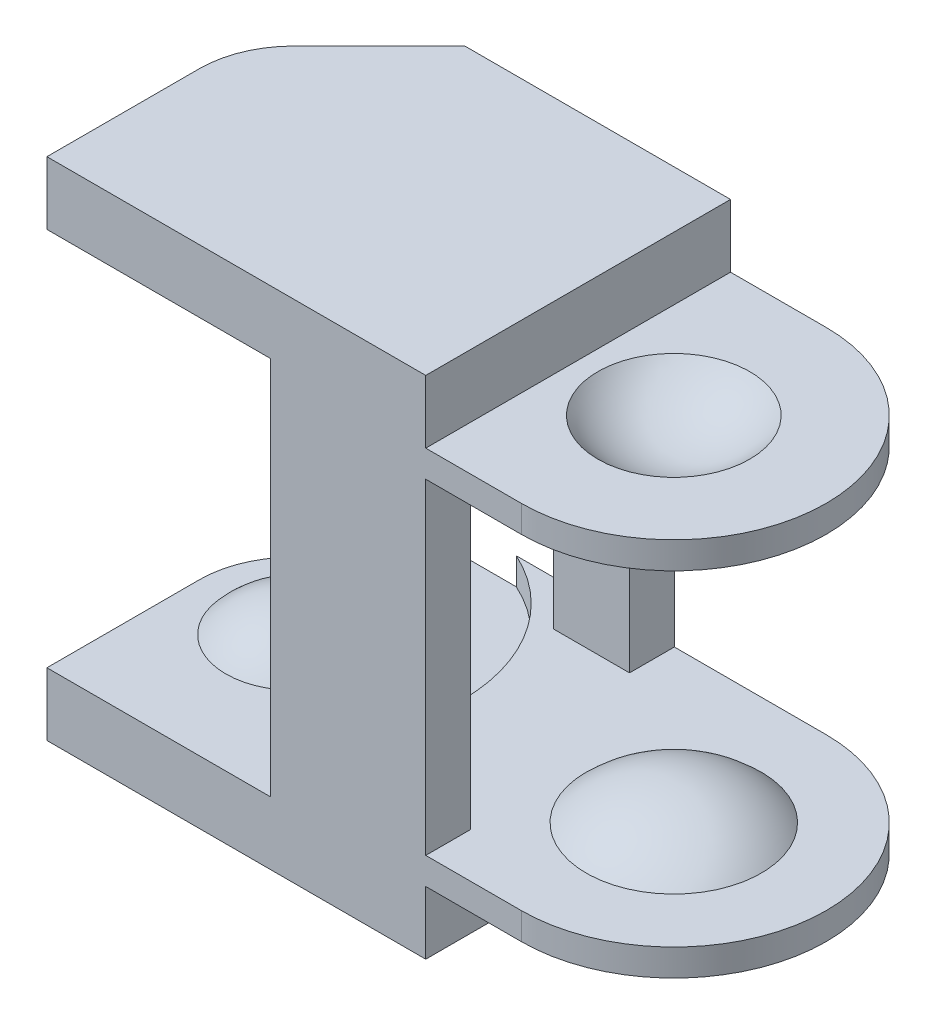
ISO-10303-21;
HEADER;
FILE_DESCRIPTION(('STEP AP214'),'2;1');
FILE_NAME('part.step','',(''),(''),'','','');
FILE_SCHEMA(('AUTOMOTIVE_DESIGN { 1 0 10303 214 1 1 1 1 }'));
ENDSEC;
DATA;
#1=APPLICATION_CONTEXT('core data for automotive mechanical design processes');
#2=APPLICATION_PROTOCOL_DEFINITION('international standard','automotive_design',2000,#1);
#3=PRODUCT_CONTEXT('',#1,'mechanical');
#4=PRODUCT('Part','Part','',(#3));
#5=PRODUCT_RELATED_PRODUCT_CATEGORY('part','',(#4));
#6=PRODUCT_DEFINITION_FORMATION('','',#4);
#7=PRODUCT_DEFINITION_CONTEXT('part definition',#1,'design');
#8=PRODUCT_DEFINITION('design','',#6,#7);
#9=PRODUCT_DEFINITION_SHAPE('','',#8);
#10=(LENGTH_UNIT() NAMED_UNIT(*) SI_UNIT(.MILLI.,.METRE.));
#11=(NAMED_UNIT(*) PLANE_ANGLE_UNIT() SI_UNIT($,.RADIAN.));
#12=(NAMED_UNIT(*) SI_UNIT($,.STERADIAN.) SOLID_ANGLE_UNIT());
#13=UNCERTAINTY_MEASURE_WITH_UNIT(LENGTH_MEASURE(1.E-05),#10,'distance_accuracy_value','');
#14=(GEOMETRIC_REPRESENTATION_CONTEXT(3) GLOBAL_UNCERTAINTY_ASSIGNED_CONTEXT((#13)) GLOBAL_UNIT_ASSIGNED_CONTEXT((#10,
#11,#12)) REPRESENTATION_CONTEXT('',''));
#15=CARTESIAN_POINT('',(0.,0.,0.));
#16=DIRECTION('',(0.,0.,1.));
#17=DIRECTION('',(1.,0.,0.));
#18=AXIS2_PLACEMENT_3D('',#15,#16,#17);
#19=CARTESIAN_POINT('',(0.961889819897504,-0.9,-21.4562459645916));
#20=DIRECTION('',(0.,-1.,0.));
#21=DIRECTION('',(0.,0.,-1.));
#22=AXIS2_PLACEMENT_3D('',#19,#20,#21);
#23=PLANE('',#22);
#24=CARTESIAN_POINT('',(6.35,-0.900000000000002,-3.175));
#25=DIRECTION('',(0.,1.,0.));
#26=DIRECTION('',(-1.,0.,0.));
#27=AXIS2_PLACEMENT_3D('',#24,#25,#26);
#28=CIRCLE('',#27,2.92856225556152);
#29=CARTESIAN_POINT('',(3.42143774443848,-0.900000000000004,-3.175));
#30=VERTEX_POINT('',#29);
#31=EDGE_CURVE('E296',#30,#30,#28,.T.);
#32=ORIENTED_EDGE('',*,*,#31,.T.);
#33=EDGE_LOOP('',(#32));
#34=FACE_BOUND('',#33,.T.);
#35=DIRECTION('',(-1.,0.,0.));
#36=VECTOR('',#35,1.);
#37=CARTESIAN_POINT('',(1.27,-0.9,-6.773779639795));
#38=LINE('',#37,#36);
#39=CARTESIAN_POINT('',(1.27,-0.9,-6.773779639795));
#40=VERTEX_POINT('',#39);
#41=CARTESIAN_POINT('',(-1.27,-0.9,-6.773779639795));
#42=VERTEX_POINT('',#41);
#43=EDGE_CURVE('E49',#40,#42,#38,.T.);
#44=ORIENTED_EDGE('',*,*,#43,.F.);
#45=DIRECTION('',(0.,0.,1.));
#46=VECTOR('',#45,1.);
#47=CARTESIAN_POINT('',(1.27,-0.9,-8.273779639795));
#48=LINE('',#47,#46);
#49=CARTESIAN_POINT('',(1.27,-0.9,-8.273779639795));
#50=VERTEX_POINT('',#49);
#51=EDGE_CURVE('E268',#50,#40,#48,.T.);
#52=ORIENTED_EDGE('',*,*,#51,.F.);
#53=DIRECTION('',(1.,0.,0.));
#54=VECTOR('',#53,1.);
#55=CARTESIAN_POINT('',(0.961889819897504,-0.9,-8.273779639795));
#56=LINE('',#55,#54);
#57=CARTESIAN_POINT('',(6.35,-0.9,-8.273779639795));
#58=VERTEX_POINT('',#57);
#59=EDGE_CURVE('E220',#50,#58,#56,.T.);
#60=ORIENTED_EDGE('',*,*,#59,.T.);
#61=CARTESIAN_POINT('',(6.35,-0.9,-3.175));
#62=DIRECTION('',(0.,-1.,0.));
#63=DIRECTION('',(0.,0.,-1.));
#64=AXIS2_PLACEMENT_3D('',#61,#62,#63);
#65=CIRCLE('',#64,5.09877963979501);
#66=CARTESIAN_POINT('',(6.35,-0.9,1.92377963979501));
#67=VERTEX_POINT('',#66);
#68=EDGE_CURVE('E306',#58,#67,#65,.T.);
#69=ORIENTED_EDGE('',*,*,#68,.T.);
#70=DIRECTION('',(-1.,0.,0.));
#71=VECTOR('',#70,1.);
#72=CARTESIAN_POINT('',(0.961889819897509,-0.9,1.92377963979501));
#73=LINE('',#72,#71);
#74=CARTESIAN_POINT('',(3.1496,-0.9,1.92377963979501));
#75=VERTEX_POINT('',#74);
#76=EDGE_CURVE('E308',#67,#75,#73,.T.);
#77=ORIENTED_EDGE('',*,*,#76,.T.);
#78=DIRECTION('',(0.,0.,-1.));
#79=VECTOR('',#78,1.);
#80=CARTESIAN_POINT('',(3.1496,-0.9,-21.4562459645916));
#81=LINE('',#80,#79);
#82=CARTESIAN_POINT('',(3.1496,-0.9,0.423779639795008));
#83=VERTEX_POINT('',#82);
#84=EDGE_CURVE('E290',#75,#83,#81,.T.);
#85=ORIENTED_EDGE('',*,*,#84,.T.);
#86=DIRECTION('',(-1.,0.,0.));
#87=VECTOR('',#86,1.);
#88=CARTESIAN_POINT('',(0.961889819897504,-0.9,0.423779639795008));
#89=LINE('',#88,#87);
#90=CARTESIAN_POINT('',(-2.05060899272738,-0.9,0.423779639795008));
#91=VERTEX_POINT('',#90);
#92=EDGE_CURVE('E287',#83,#91,#89,.T.);
#93=ORIENTED_EDGE('',*,*,#92,.T.);
#94=CARTESIAN_POINT('',(-6.35,-0.9,-3.175));
#95=DIRECTION('',(0.,-1.,0.));
#96=DIRECTION('',(0.,0.,-1.));
#97=AXIS2_PLACEMENT_3D('',#94,#95,#96);
#98=CIRCLE('',#97,5.606779639795);
#99=CARTESIAN_POINT('',(-4.01795709429871,-0.9,-8.273779639795));
#100=VERTEX_POINT('',#99);
#101=EDGE_CURVE('E300',#100,#91,#98,.T.);
#102=ORIENTED_EDGE('',*,*,#101,.F.);
#103=CARTESIAN_POINT('',(-1.27,-0.9,-8.273779639795));
#104=VERTEX_POINT('',#103);
#105=EDGE_CURVE('E304',#100,#104,#56,.T.);
#106=ORIENTED_EDGE('',*,*,#105,.T.);
#107=DIRECTION('',(0.,0.,-1.));
#108=VECTOR('',#107,1.);
#109=CARTESIAN_POINT('',(-1.27,-0.9,-8.273779639795));
#110=LINE('',#109,#108);
#111=EDGE_CURVE('E54',#42,#104,#110,.T.);
#112=ORIENTED_EDGE('',*,*,#111,.F.);
#113=EDGE_LOOP('',(#44,#52,#60,#69,#77,#85,#93,#102,#106,#112));
#114=FACE_BOUND('',#113,.T.);
#115=ADVANCED_FACE('F34',(#34,#114),#23,.T.);
#116=CARTESIAN_POINT('',(0.961889819897504,0.,-21.4562459645916));
#117=DIRECTION('',(0.,-1.,0.));
#118=DIRECTION('',(0.,0.,-1.));
#119=AXIS2_PLACEMENT_3D('',#116,#117,#118);
#120=PLANE('',#119);
#121=DIRECTION('',(0.,0.,-1.));
#122=VECTOR('',#121,1.);
#123=CARTESIAN_POINT('',(3.1496,0.,-3.175));
#124=LINE('',#123,#122);
#125=CARTESIAN_POINT('',(3.1496,0.,1.92377963979501));
#126=VERTEX_POINT('',#125);
#127=CARTESIAN_POINT('',(3.1496,0.,-8.273779639795));
#128=VERTEX_POINT('',#127);
#129=EDGE_CURVE('E335',#126,#128,#124,.T.);
#130=ORIENTED_EDGE('',*,*,#129,.F.);
#131=DIRECTION('',(-1.,0.,0.));
#132=VECTOR('',#131,1.);
#133=CARTESIAN_POINT('',(0.961889819897509,0.,1.92377963979501));
#134=LINE('',#133,#132);
#135=CARTESIAN_POINT('',(6.35,0.,1.92377963979501));
#136=VERTEX_POINT('',#135);
#137=EDGE_CURVE('E360',#136,#126,#134,.T.);
#138=ORIENTED_EDGE('',*,*,#137,.F.);
#139=CARTESIAN_POINT('',(6.35,0.,-3.175));
#140=DIRECTION('',(0.,-1.,0.));
#141=DIRECTION('',(0.,0.,-1.));
#142=AXIS2_PLACEMENT_3D('',#139,#140,#141);
#143=CIRCLE('',#142,5.09877963979501);
#144=CARTESIAN_POINT('',(6.35,0.,-8.273779639795));
#145=VERTEX_POINT('',#144);
#146=EDGE_CURVE('E381',#145,#136,#143,.T.);
#147=ORIENTED_EDGE('',*,*,#146,.F.);
#148=DIRECTION('',(1.,0.,0.));
#149=VECTOR('',#148,1.);
#150=CARTESIAN_POINT('',(0.961889819897504,0.,-8.273779639795));
#151=LINE('',#150,#149);
#152=EDGE_CURVE('E317',#128,#145,#151,.T.);
#153=ORIENTED_EDGE('',*,*,#152,.F.);
#154=EDGE_LOOP('',(#130,#138,#147,#153));
#155=FACE_BOUND('',#154,.T.);
#156=CARTESIAN_POINT('',(6.35,0.,-3.175));
#157=DIRECTION('',(0.,1.,0.));
#158=DIRECTION('',(0.,0.,1.));
#159=AXIS2_PLACEMENT_3D('',#156,#157,#158);
#160=CIRCLE('',#159,2.54);
#161=CARTESIAN_POINT('',(6.35,0.,-0.634999999999999));
#162=VERTEX_POINT('',#161);
#163=EDGE_CURVE('E293',#162,#162,#160,.T.);
#164=ORIENTED_EDGE('',*,*,#163,.F.);
#165=EDGE_LOOP('',(#164));
#166=FACE_BOUND('',#165,.T.);
#167=ADVANCED_FACE('F472',(#155,#166),#120,.F.);
#168=CARTESIAN_POINT('',(-6.35,0.,-3.175));
#169=DIRECTION('',(0.,1.,0.));
#170=DIRECTION('',(0.,0.,1.));
#171=AXIS2_PLACEMENT_3D('',#168,#169,#170);
#172=PLANE('',#171);
#173=DIRECTION('',(-1.,0.,0.));
#174=VECTOR('',#173,1.);
#175=CARTESIAN_POINT('',(-5.74134842073958,0.,-8.273779639795));
#176=LINE('',#175,#174);
#177=CARTESIAN_POINT('',(-4.01795709429871,0.,-8.273779639795));
#178=VERTEX_POINT('',#177);
#179=CARTESIAN_POINT('',(-5.74134842073958,0.,-8.273779639795));
#180=VERTEX_POINT('',#179);
#181=EDGE_CURVE('E338',#178,#180,#176,.T.);
#182=ORIENTED_EDGE('',*,*,#181,.F.);
#183=CARTESIAN_POINT('',(-6.35,0.,-3.175));
#184=DIRECTION('',(0.,-1.,0.));
#185=DIRECTION('',(0.,0.,-1.));
#186=AXIS2_PLACEMENT_3D('',#183,#184,#185);
#187=CIRCLE('',#186,5.606779639795);
#188=CARTESIAN_POINT('',(-2.05060899272738,0.,0.423779639795008));
#189=VERTEX_POINT('',#188);
#190=EDGE_CURVE('E299',#178,#189,#187,.T.);
#191=ORIENTED_EDGE('',*,*,#190,.T.);
#192=DIRECTION('',(0.,0.,-1.));
#193=VECTOR('',#192,1.);
#194=CARTESIAN_POINT('',(-2.05060899272738,0.,-21.4562459645916));
#195=LINE('',#194,#193);
#196=CARTESIAN_POINT('',(-2.05060899272738,0.,1.92377963979501));
#197=VERTEX_POINT('',#196);
#198=EDGE_CURVE('E303',#197,#189,#195,.T.);
#199=ORIENTED_EDGE('',*,*,#198,.F.);
#200=DIRECTION('',(1.,0.,0.));
#201=VECTOR('',#200,1.);
#202=CARTESIAN_POINT('',(-6.98990972304999,0.,1.92377963979501));
#203=LINE('',#202,#201);
#204=CARTESIAN_POINT('',(-9.525,0.,1.92377963979501));
#205=VERTEX_POINT('',#204);
#206=EDGE_CURVE('E339',#205,#197,#203,.T.);
#207=ORIENTED_EDGE('',*,*,#206,.F.);
#208=DIRECTION('',(0.,0.,1.));
#209=VECTOR('',#208,1.);
#210=CARTESIAN_POINT('',(-9.525,0.,-3.17499999999998));
#211=LINE('',#210,#209);
#212=CARTESIAN_POINT('',(-9.525,0.,-3.17499999999998));
#213=VERTEX_POINT('',#212);
#214=EDGE_CURVE('E357',#213,#205,#211,.T.);
#215=ORIENTED_EDGE('',*,*,#214,.F.);
#216=CARTESIAN_POINT('',(-6.35,0.,-3.175));
#217=DIRECTION('',(0.,1.,0.));
#218=DIRECTION('',(0.,0.,1.));
#219=AXIS2_PLACEMENT_3D('',#216,#217,#218);
#220=CIRCLE('',#219,3.175);
#221=CARTESIAN_POINT('',(-8.59506403026729,0.,-5.42006403026728));
#222=VERTEX_POINT('',#221);
#223=EDGE_CURVE('E323',#222,#213,#220,.T.);
#224=ORIENTED_EDGE('',*,*,#223,.F.);
#225=DIRECTION('',(-0.707106781186546,0.,0.707106781186549));
#226=VECTOR('',#225,1.);
#227=CARTESIAN_POINT('',(-8.59506403026729,0.,-5.42006403026728));
#228=LINE('',#227,#226);
#229=EDGE_CURVE('E349',#180,#222,#228,.T.);
#230=ORIENTED_EDGE('',*,*,#229,.F.);
#231=EDGE_LOOP('',(#182,#191,#199,#207,#215,#224,#230));
#232=FACE_BOUND('',#231,.T.);
#233=CARTESIAN_POINT('',(-6.35,0.,-3.175));
#234=DIRECTION('',(0.,1.,0.));
#235=DIRECTION('',(0.,0.,1.));
#236=AXIS2_PLACEMENT_3D('',#233,#234,#235);
#237=CIRCLE('',#236,2.286);
#238=CARTESIAN_POINT('',(-6.35,0.,-0.888999999999999));
#239=VERTEX_POINT('',#238);
#240=EDGE_CURVE('E11',#239,#239,#237,.F.);
#241=ORIENTED_EDGE('',*,*,#240,.F.);
#242=EDGE_LOOP('',(#241));
#243=FACE_BOUND('',#242,.T.);
#244=ADVANCED_FACE('F420',(#232,#243),#172,.F.);
#245=CARTESIAN_POINT('',(-6.35,2.1082,-3.175));
#246=DIRECTION('',(0.,-1.,0.));
#247=DIRECTION('',(0.,0.,-1.));
#248=AXIS2_PLACEMENT_3D('',#245,#246,#247);
#249=CYLINDRICAL_SURFACE('',#248,3.175);
#250=ORIENTED_EDGE('',*,*,#223,.T.);
#251=DIRECTION('',(0.,-1.,0.));
#252=VECTOR('',#251,1.);
#253=CARTESIAN_POINT('',(-9.525,2.1082,-3.17499999999998));
#254=LINE('',#253,#252);
#255=CARTESIAN_POINT('',(-9.525,2.1082,-3.17499999999998));
#256=VERTEX_POINT('',#255);
#257=EDGE_CURVE('E42',#256,#213,#254,.T.);
#258=ORIENTED_EDGE('',*,*,#257,.F.);
#259=CARTESIAN_POINT('',(-6.35,2.1082,-3.175));
#260=DIRECTION('',(0.,1.,0.));
#261=DIRECTION('',(0.,0.,1.));
#262=AXIS2_PLACEMENT_3D('',#259,#260,#261);
#263=CIRCLE('',#262,3.175);
#264=CARTESIAN_POINT('',(-8.59506403026729,2.1082,-5.42006403026728));
#265=VERTEX_POINT('',#264);
#266=EDGE_CURVE('E383',#265,#256,#263,.T.);
#267=ORIENTED_EDGE('',*,*,#266,.F.);
#268=DIRECTION('',(0.,-1.,0.));
#269=VECTOR('',#268,1.);
#270=CARTESIAN_POINT('',(-8.59506403026729,2.1082,-5.42006403026728));
#271=LINE('',#270,#269);
#272=EDGE_CURVE('E396',#265,#222,#271,.T.);
#273=ORIENTED_EDGE('',*,*,#272,.T.);
#274=EDGE_LOOP('',(#250,#258,#267,#273));
#275=FACE_BOUND('',#274,.T.);
#276=ADVANCED_FACE('F36',(#275),#249,.T.);
#277=CARTESIAN_POINT('',(-9.525,2.1082,-3.17499999999998));
#278=DIRECTION('',(1.,0.,0.));
#279=DIRECTION('',(0.,0.,-1.));
#280=AXIS2_PLACEMENT_3D('',#277,#278,#279);
#281=PLANE('',#280);
#282=ORIENTED_EDGE('',*,*,#214,.T.);
#283=DIRECTION('',(0.,-1.,0.));
#284=VECTOR('',#283,1.);
#285=CARTESIAN_POINT('',(-9.525,2.1082,1.92377963979501));
#286=LINE('',#285,#284);
#287=CARTESIAN_POINT('',(-9.525,2.1082,1.92377963979501));
#288=VERTEX_POINT('',#287);
#289=EDGE_CURVE('E334',#288,#205,#286,.T.);
#290=ORIENTED_EDGE('',*,*,#289,.F.);
#291=DIRECTION('',(0.,0.,1.));
#292=VECTOR('',#291,1.);
#293=CARTESIAN_POINT('',(-9.525,2.1082,-3.17499999999998));
#294=LINE('',#293,#292);
#295=EDGE_CURVE('E386',#256,#288,#294,.T.);
#296=ORIENTED_EDGE('',*,*,#295,.F.);
#297=ORIENTED_EDGE('',*,*,#257,.T.);
#298=EDGE_LOOP('',(#282,#290,#296,#297));
#299=FACE_BOUND('',#298,.T.);
#300=ADVANCED_FACE('F403',(#299),#281,.F.);
#301=CARTESIAN_POINT('',(-6.98990972304999,2.1082,1.92377963979501));
#302=DIRECTION('',(0.,0.,-1.));
#303=DIRECTION('',(-1.,0.,0.));
#304=AXIS2_PLACEMENT_3D('',#301,#302,#303);
#305=PLANE('',#304);
#306=ORIENTED_EDGE('',*,*,#206,.T.);
#307=DIRECTION('',(0.,1.,0.));
#308=VECTOR('',#307,1.);
#309=CARTESIAN_POINT('',(-2.05060899272738,-0.9,1.92377963979501));
#310=LINE('',#309,#308);
#311=CARTESIAN_POINT('',(-2.05060899272738,-12.7,1.92377963979501));
#312=VERTEX_POINT('',#311);
#313=EDGE_CURVE('E362',#312,#197,#310,.T.);
#314=ORIENTED_EDGE('',*,*,#313,.F.);
#315=DIRECTION('',(1.,0.,0.));
#316=VECTOR('',#315,1.);
#317=CARTESIAN_POINT('',(-6.98990972304999,-12.7,1.92377963979501));
#318=LINE('',#317,#316);
#319=CARTESIAN_POINT('',(-9.525,-12.7,1.92377963979501));
#320=VERTEX_POINT('',#319);
#321=EDGE_CURVE('E888',#320,#312,#318,.T.);
#322=ORIENTED_EDGE('',*,*,#321,.F.);
#323=DIRECTION('',(0.,1.,0.));
#324=VECTOR('',#323,1.);
#325=CARTESIAN_POINT('',(-9.525,-14.8082,1.92377963979501));
#326=LINE('',#325,#324);
#327=CARTESIAN_POINT('',(-9.525,-14.8082,1.92377963979501));
#328=VERTEX_POINT('',#327);
#329=EDGE_CURVE('E906',#328,#320,#326,.T.);
#330=ORIENTED_EDGE('',*,*,#329,.F.);
#331=DIRECTION('',(1.,0.,0.));
#332=VECTOR('',#331,1.);
#333=CARTESIAN_POINT('',(-9.525,-14.8082,1.92377963979501));
#334=LINE('',#333,#332);
#335=CARTESIAN_POINT('',(3.1496,-14.8082,1.92377963979501));
#336=VERTEX_POINT('',#335);
#337=EDGE_CURVE('E869',#328,#336,#334,.T.);
#338=ORIENTED_EDGE('',*,*,#337,.T.);
#339=DIRECTION('',(0.,1.,0.));
#340=VECTOR('',#339,1.);
#341=CARTESIAN_POINT('',(3.1496,-14.8082,1.92377963979501));
#342=LINE('',#341,#340);
#343=CARTESIAN_POINT('',(3.1496,-12.7,1.92377963979501));
#344=VERTEX_POINT('',#343);
#345=EDGE_CURVE('E904',#336,#344,#342,.T.);
#346=ORIENTED_EDGE('',*,*,#345,.T.);
#347=DIRECTION('',(-1.,0.,0.));
#348=VECTOR('',#347,1.);
#349=CARTESIAN_POINT('',(0.961889819897509,-12.7,1.92377963979501));
#350=LINE('',#349,#348);
#351=CARTESIAN_POINT('',(6.35,-12.7,1.92377963979501));
#352=VERTEX_POINT('',#351);
#353=EDGE_CURVE('E851',#352,#344,#350,.T.);
#354=ORIENTED_EDGE('',*,*,#353,.F.);
#355=DIRECTION('',(0.,-1.,0.));
#356=VECTOR('',#355,1.);
#357=CARTESIAN_POINT('',(6.35,-11.8,1.92377963979501));
#358=LINE('',#357,#356);
#359=CARTESIAN_POINT('',(6.35,-11.8,1.92377963979501));
#360=VERTEX_POINT('',#359);
#361=EDGE_CURVE('E848',#360,#352,#358,.T.);
#362=ORIENTED_EDGE('',*,*,#361,.F.);
#363=DIRECTION('',(-1.,0.,0.));
#364=VECTOR('',#363,1.);
#365=CARTESIAN_POINT('',(0.961889819897509,-11.8,1.92377963979501));
#366=LINE('',#365,#364);
#367=CARTESIAN_POINT('',(3.1496,-11.8,1.92377963979501));
#368=VERTEX_POINT('',#367);
#369=EDGE_CURVE('E248',#360,#368,#366,.T.);
#370=ORIENTED_EDGE('',*,*,#369,.T.);
#371=DIRECTION('',(0.,1.,0.));
#372=VECTOR('',#371,1.);
#373=CARTESIAN_POINT('',(3.1496,-6.35,1.92377963979501));
#374=LINE('',#373,#372);
#375=EDGE_CURVE('E284',#368,#75,#374,.T.);
#376=ORIENTED_EDGE('',*,*,#375,.T.);
#377=ORIENTED_EDGE('',*,*,#76,.F.);
#378=DIRECTION('',(0.,1.,0.));
#379=VECTOR('',#378,1.);
#380=CARTESIAN_POINT('',(6.35,-0.9,1.92377963979501));
#381=LINE('',#380,#379);
#382=EDGE_CURVE('E364',#67,#136,#381,.T.);
#383=ORIENTED_EDGE('',*,*,#382,.T.);
#384=ORIENTED_EDGE('',*,*,#137,.T.);
#385=DIRECTION('',(0.,-1.,0.));
#386=VECTOR('',#385,1.);
#387=CARTESIAN_POINT('',(3.1496,2.1082,1.92377963979501));
#388=LINE('',#387,#386);
#389=CARTESIAN_POINT('',(3.1496,2.1082,1.92377963979501));
#390=VERTEX_POINT('',#389);
#391=EDGE_CURVE('E329',#390,#126,#388,.T.);
#392=ORIENTED_EDGE('',*,*,#391,.F.);
#393=DIRECTION('',(1.,0.,0.));
#394=VECTOR('',#393,1.);
#395=CARTESIAN_POINT('',(-9.525,2.1082,1.92377963979501));
#396=LINE('',#395,#394);
#397=EDGE_CURVE('E388',#288,#390,#396,.T.);
#398=ORIENTED_EDGE('',*,*,#397,.F.);
#399=ORIENTED_EDGE('',*,*,#289,.T.);
#400=EDGE_LOOP('',(#306,#314,#322,#330,#338,#346,#354,#362,#370,#376,#377,#383,#384,#392,#398,#399));
#401=FACE_BOUND('',#400,.T.);
#402=ADVANCED_FACE('F409',(#401),#305,.F.);
#403=CARTESIAN_POINT('',(3.1496,2.1082,-3.175));
#404=DIRECTION('',(-1.,0.,0.));
#405=DIRECTION('',(0.,0.,1.));
#406=AXIS2_PLACEMENT_3D('',#403,#404,#405);
#407=PLANE('',#406);
#408=ORIENTED_EDGE('',*,*,#129,.T.);
#409=DIRECTION('',(0.,-1.,0.));
#410=VECTOR('',#409,1.);
#411=CARTESIAN_POINT('',(3.1496,2.1082,-8.273779639795));
#412=LINE('',#411,#410);
#413=CARTESIAN_POINT('',(3.1496,2.1082,-8.273779639795));
#414=VERTEX_POINT('',#413);
#415=EDGE_CURVE('E327',#414,#128,#412,.T.);
#416=ORIENTED_EDGE('',*,*,#415,.F.);
#417=DIRECTION('',(0.,0.,-1.));
#418=VECTOR('',#417,1.);
#419=CARTESIAN_POINT('',(3.1496,2.1082,-3.175));
#420=LINE('',#419,#418);
#421=EDGE_CURVE('E390',#390,#414,#420,.T.);
#422=ORIENTED_EDGE('',*,*,#421,.F.);
#423=ORIENTED_EDGE('',*,*,#391,.T.);
#424=EDGE_LOOP('',(#408,#416,#422,#423));
#425=FACE_BOUND('',#424,.T.);
#426=ADVANCED_FACE('F502',(#425),#407,.F.);
#427=CARTESIAN_POINT('',(-5.74134842073958,2.1082,-8.273779639795));
#428=DIRECTION('',(0.,0.,1.));
#429=DIRECTION('',(1.,0.,0.));
#430=AXIS2_PLACEMENT_3D('',#427,#428,#429);
#431=PLANE('',#430);
#432=ORIENTED_EDGE('',*,*,#415,.T.);
#433=ORIENTED_EDGE('',*,*,#152,.T.);
#434=DIRECTION('',(0.,1.,0.));
#435=VECTOR('',#434,1.);
#436=CARTESIAN_POINT('',(6.35,-0.9,-8.273779639795));
#437=LINE('',#436,#435);
#438=EDGE_CURVE('E324',#58,#145,#437,.T.);
#439=ORIENTED_EDGE('',*,*,#438,.F.);
#440=ORIENTED_EDGE('',*,*,#59,.F.);
#441=DIRECTION('',(0.,1.,0.));
#442=VECTOR('',#441,1.);
#443=CARTESIAN_POINT('',(1.27,-6.35,-8.273779639795));
#444=LINE('',#443,#442);
#445=CARTESIAN_POINT('',(1.27,-11.8,-8.273779639795));
#446=VERTEX_POINT('',#445);
#447=EDGE_CURVE('E212',#446,#50,#444,.T.);
#448=ORIENTED_EDGE('',*,*,#447,.F.);
#449=DIRECTION('',(1.,0.,0.));
#450=VECTOR('',#449,1.);
#451=CARTESIAN_POINT('',(0.961889819897504,-11.8,-8.273779639795));
#452=LINE('',#451,#450);
#453=CARTESIAN_POINT('',(6.35,-11.8,-8.273779639795));
#454=VERTEX_POINT('',#453);
#455=EDGE_CURVE('E217',#446,#454,#452,.T.);
#456=ORIENTED_EDGE('',*,*,#455,.T.);
#457=DIRECTION('',(0.,-1.,0.));
#458=VECTOR('',#457,1.);
#459=CARTESIAN_POINT('',(6.35,-11.8,-8.273779639795));
#460=LINE('',#459,#458);
#461=CARTESIAN_POINT('',(6.35,-12.7,-8.273779639795));
#462=VERTEX_POINT('',#461);
#463=EDGE_CURVE('E847',#454,#462,#460,.T.);
#464=ORIENTED_EDGE('',*,*,#463,.T.);
#465=DIRECTION('',(1.,0.,0.));
#466=VECTOR('',#465,1.);
#467=CARTESIAN_POINT('',(0.961889819897504,-12.7,-8.273779639795));
#468=LINE('',#467,#466);
#469=CARTESIAN_POINT('',(3.1496,-12.7,-8.273779639795));
#470=VERTEX_POINT('',#469);
#471=EDGE_CURVE('E261',#470,#462,#468,.T.);
#472=ORIENTED_EDGE('',*,*,#471,.F.);
#473=DIRECTION('',(0.,1.,0.));
#474=VECTOR('',#473,1.);
#475=CARTESIAN_POINT('',(3.1496,-14.8082,-8.273779639795));
#476=LINE('',#475,#474);
#477=CARTESIAN_POINT('',(3.1496,-14.8082,-8.273779639795));
#478=VERTEX_POINT('',#477);
#479=EDGE_CURVE('E907',#478,#470,#476,.T.);
#480=ORIENTED_EDGE('',*,*,#479,.F.);
#481=DIRECTION('',(-1.,0.,0.));
#482=VECTOR('',#481,1.);
#483=CARTESIAN_POINT('',(-5.74134842073958,-14.8082,-8.273779639795));
#484=LINE('',#483,#482);
#485=CARTESIAN_POINT('',(-5.74134842073958,-14.8082,-8.273779639795));
#486=VERTEX_POINT('',#485);
#487=EDGE_CURVE('E875',#478,#486,#484,.T.);
#488=ORIENTED_EDGE('',*,*,#487,.T.);
#489=DIRECTION('',(0.,1.,0.));
#490=VECTOR('',#489,1.);
#491=CARTESIAN_POINT('',(-5.74134842073958,-14.8082,-8.273779639795));
#492=LINE('',#491,#490);
#493=CARTESIAN_POINT('',(-5.74134842073958,-12.7,-8.273779639795));
#494=VERTEX_POINT('',#493);
#495=EDGE_CURVE('E911',#486,#494,#492,.T.);
#496=ORIENTED_EDGE('',*,*,#495,.T.);
#497=DIRECTION('',(-1.,0.,0.));
#498=VECTOR('',#497,1.);
#499=CARTESIAN_POINT('',(-5.74134842073958,-12.7,-8.273779639795));
#500=LINE('',#499,#498);
#501=CARTESIAN_POINT('',(-4.01795709429871,-12.7,-8.273779639795));
#502=VERTEX_POINT('',#501);
#503=EDGE_CURVE('E897',#502,#494,#500,.T.);
#504=ORIENTED_EDGE('',*,*,#503,.F.);
#505=DIRECTION('',(0.,-1.,0.));
#506=VECTOR('',#505,1.);
#507=CARTESIAN_POINT('',(-4.01795709429871,-11.8,-8.273779639795));
#508=LINE('',#507,#506);
#509=CARTESIAN_POINT('',(-4.01795709429871,-11.8,-8.273779639795));
#510=VERTEX_POINT('',#509);
#511=EDGE_CURVE('E885',#510,#502,#508,.T.);
#512=ORIENTED_EDGE('',*,*,#511,.F.);
#513=CARTESIAN_POINT('',(-1.27,-11.8,-8.273779639795));
#514=VERTEX_POINT('',#513);
#515=EDGE_CURVE('E238',#510,#514,#452,.T.);
#516=ORIENTED_EDGE('',*,*,#515,.T.);
#517=DIRECTION('',(0.,1.,0.));
#518=VECTOR('',#517,1.);
#519=CARTESIAN_POINT('',(-1.27,-6.35,-8.273779639795));
#520=LINE('',#519,#518);
#521=EDGE_CURVE('E223',#514,#104,#520,.T.);
#522=ORIENTED_EDGE('',*,*,#521,.T.);
#523=ORIENTED_EDGE('',*,*,#105,.F.);
#524=DIRECTION('',(0.,1.,0.));
#525=VECTOR('',#524,1.);
#526=CARTESIAN_POINT('',(-4.01795709429871,-0.9,-8.273779639795));
#527=LINE('',#526,#525);
#528=EDGE_CURVE('E320',#100,#178,#527,.T.);
#529=ORIENTED_EDGE('',*,*,#528,.T.);
#530=ORIENTED_EDGE('',*,*,#181,.T.);
#531=DIRECTION('',(0.,-1.,0.));
#532=VECTOR('',#531,1.);
#533=CARTESIAN_POINT('',(-5.74134842073958,2.1082,-8.273779639795));
#534=LINE('',#533,#532);
#535=CARTESIAN_POINT('',(-5.74134842073958,2.1082,-8.273779639795));
#536=VERTEX_POINT('',#535);
#537=EDGE_CURVE('E330',#536,#180,#534,.T.);
#538=ORIENTED_EDGE('',*,*,#537,.F.);
#539=DIRECTION('',(-1.,0.,0.));
#540=VECTOR('',#539,1.);
#541=CARTESIAN_POINT('',(-5.74134842073958,2.1082,-8.273779639795));
#542=LINE('',#541,#540);
#543=EDGE_CURVE('E392',#414,#536,#542,.T.);
#544=ORIENTED_EDGE('',*,*,#543,.F.);
#545=EDGE_LOOP('',(#432,#433,#439,#440,#448,#456,#464,#472,#480,#488,#496,#504,#512,#516,#522,
#523,#529,#530,#538,#544));
#546=FACE_BOUND('',#545,.T.);
#547=ADVANCED_FACE('F215',(#546),#431,.F.);
#548=CARTESIAN_POINT('',(-8.59506403026729,2.1082,-5.42006403026728));
#549=DIRECTION('',(0.707106781186549,0.,0.707106781186546));
#550=DIRECTION('',(0.707106781186546,0.,-0.707106781186549));
#551=AXIS2_PLACEMENT_3D('',#548,#549,#550);
#552=PLANE('',#551);
#553=ORIENTED_EDGE('',*,*,#229,.T.);
#554=ORIENTED_EDGE('',*,*,#272,.F.);
#555=DIRECTION('',(-0.707106781186546,0.,0.707106781186549));
#556=VECTOR('',#555,1.);
#557=CARTESIAN_POINT('',(-8.59506403026729,2.1082,-5.42006403026728));
#558=LINE('',#557,#556);
#559=EDGE_CURVE('E394',#536,#265,#558,.T.);
#560=ORIENTED_EDGE('',*,*,#559,.F.);
#561=ORIENTED_EDGE('',*,*,#537,.T.);
#562=EDGE_LOOP('',(#553,#554,#560,#561));
#563=FACE_BOUND('',#562,.T.);
#564=ADVANCED_FACE('F422',(#563),#552,.F.);
#565=CARTESIAN_POINT('',(-6.35,2.1082,-3.175));
#566=DIRECTION('',(0.,1.,0.));
#567=DIRECTION('',(0.,0.,1.));
#568=AXIS2_PLACEMENT_3D('',#565,#566,#567);
#569=PLANE('',#568);
#570=ORIENTED_EDGE('',*,*,#266,.T.);
#571=ORIENTED_EDGE('',*,*,#295,.T.);
#572=ORIENTED_EDGE('',*,*,#397,.T.);
#573=ORIENTED_EDGE('',*,*,#421,.T.);
#574=ORIENTED_EDGE('',*,*,#543,.T.);
#575=ORIENTED_EDGE('',*,*,#559,.T.);
#576=EDGE_LOOP('',(#570,#571,#572,#573,#574,#575));
#577=FACE_BOUND('',#576,.T.);
#578=ADVANCED_FACE('F492',(#577),#569,.T.);
#579=CARTESIAN_POINT('',(-6.35,-0.9,-3.175));
#580=DIRECTION('',(0.,1.,0.));
#581=DIRECTION('',(0.,0.,1.));
#582=AXIS2_PLACEMENT_3D('',#579,#580,#581);
#583=CYLINDRICAL_SURFACE('',#582,5.606779639795);
#584=ORIENTED_EDGE('',*,*,#190,.F.);
#585=ORIENTED_EDGE('',*,*,#528,.F.);
#586=ORIENTED_EDGE('',*,*,#101,.T.);
#587=DIRECTION('',(0.,1.,0.));
#588=VECTOR('',#587,1.);
#589=CARTESIAN_POINT('',(-2.05060899272738,-0.9,0.423779639795008));
#590=LINE('',#589,#588);
#591=EDGE_CURVE('E311',#91,#189,#590,.T.);
#592=ORIENTED_EDGE('',*,*,#591,.T.);
#593=EDGE_LOOP('',(#584,#585,#586,#592));
#594=FACE_BOUND('',#593,.T.);
#595=ADVANCED_FACE('F427',(#594),#583,.F.);
#596=CARTESIAN_POINT('',(6.35,-0.9,-3.175));
#597=DIRECTION('',(0.,1.,0.));
#598=DIRECTION('',(0.,0.,1.));
#599=AXIS2_PLACEMENT_3D('',#596,#597,#598);
#600=CYLINDRICAL_SURFACE('',#599,5.09877963979501);
#601=ORIENTED_EDGE('',*,*,#146,.T.);
#602=ORIENTED_EDGE('',*,*,#382,.F.);
#603=ORIENTED_EDGE('',*,*,#68,.F.);
#604=ORIENTED_EDGE('',*,*,#438,.T.);
#605=EDGE_LOOP('',(#601,#602,#603,#604));
#606=FACE_BOUND('',#605,.T.);
#607=ADVANCED_FACE('F486',(#606),#600,.T.);
#608=CARTESIAN_POINT('',(-2.05060899272738,-0.9,-21.4562459645916));
#609=DIRECTION('',(1.,0.,0.));
#610=DIRECTION('',(0.,0.,-1.));
#611=AXIS2_PLACEMENT_3D('',#608,#609,#610);
#612=PLANE('',#611);
#613=ORIENTED_EDGE('',*,*,#198,.T.);
#614=ORIENTED_EDGE('',*,*,#591,.F.);
#615=DIRECTION('',(0.,1.,0.));
#616=VECTOR('',#615,1.);
#617=CARTESIAN_POINT('',(-2.05060899272738,-6.35,0.423779639795008));
#618=LINE('',#617,#616);
#619=CARTESIAN_POINT('',(-2.05060899272738,-11.8,0.423779639795008));
#620=VERTEX_POINT('',#619);
#621=EDGE_CURVE('E282',#620,#91,#618,.T.);
#622=ORIENTED_EDGE('',*,*,#621,.F.);
#623=DIRECTION('',(0.,-1.,0.));
#624=VECTOR('',#623,1.);
#625=CARTESIAN_POINT('',(-2.05060899272738,-11.8,0.423779639795008));
#626=LINE('',#625,#624);
#627=CARTESIAN_POINT('',(-2.05060899272738,-12.7,0.423779639795008));
#628=VERTEX_POINT('',#627);
#629=EDGE_CURVE('E251',#620,#628,#626,.T.);
#630=ORIENTED_EDGE('',*,*,#629,.T.);
#631=DIRECTION('',(0.,0.,-1.));
#632=VECTOR('',#631,1.);
#633=CARTESIAN_POINT('',(-2.05060899272738,-12.7,-21.4562459645916));
#634=LINE('',#633,#632);
#635=EDGE_CURVE('E243',#312,#628,#634,.T.);
#636=ORIENTED_EDGE('',*,*,#635,.F.);
#637=ORIENTED_EDGE('',*,*,#313,.T.);
#638=EDGE_LOOP('',(#613,#614,#622,#630,#636,#637));
#639=FACE_BOUND('',#638,.T.);
#640=ADVANCED_FACE('F428',(#639),#612,.F.);
#641=CARTESIAN_POINT('',(-6.35,1.91818175687129,-3.175));
#642=DIRECTION('',(0.,1.,0.));
#643=DIRECTION('',(-1.,0.,0.));
#644=AXIS2_PLACEMENT_3D('',#641,#642,#643);
#645=SPHERICAL_SURFACE('',#644,2.9841610634136);
#646=ORIENTED_EDGE('',*,*,#240,.T.);
#647=EDGE_LOOP('',(#646));
#648=FACE_BOUND('',#647,.T.);
#649=ADVANCED_FACE('F481',(#648),#645,.T.);
#650=CARTESIAN_POINT('',(6.35,2.13131306319032,-3.175));
#651=DIRECTION('',(0.,1.,0.));
#652=DIRECTION('',(-1.,0.,0.));
#653=AXIS2_PLACEMENT_3D('',#650,#651,#652);
#654=SPHERICAL_SURFACE('',#653,4.214894514904);
#655=ORIENTED_EDGE('',*,*,#31,.F.);
#656=EDGE_LOOP('',(#655));
#657=FACE_BOUND('',#656,.T.);
#658=ADVANCED_FACE('F588',(#657),#654,.T.);
#659=CARTESIAN_POINT('',(6.35,2.13131306319032,-3.175));
#660=DIRECTION('',(0.,1.,0.));
#661=DIRECTION('',(1.,0.,0.));
#662=AXIS2_PLACEMENT_3D('',#659,#660,#661);
#663=SPHERICAL_SURFACE('',#662,3.315734514904);
#664=ORIENTED_EDGE('',*,*,#163,.T.);
#665=EDGE_LOOP('',(#664));
#666=FACE_BOUND('',#665,.T.);
#667=ADVANCED_FACE('F597',(#666),#663,.F.);
#668=CARTESIAN_POINT('',(3.1496,-6.35,0.423779639795008));
#669=DIRECTION('',(-1.,0.,0.));
#670=DIRECTION('',(0.,0.,1.));
#671=AXIS2_PLACEMENT_3D('',#668,#669,#670);
#672=PLANE('',#671);
#673=ORIENTED_EDGE('',*,*,#84,.F.);
#674=ORIENTED_EDGE('',*,*,#375,.F.);
#675=DIRECTION('',(0.,0.,-1.));
#676=VECTOR('',#675,1.);
#677=CARTESIAN_POINT('',(3.1496,-11.8,-21.4562459645916));
#678=LINE('',#677,#676);
#679=CARTESIAN_POINT('',(3.1496,-11.8,0.423779639795008));
#680=VERTEX_POINT('',#679);
#681=EDGE_CURVE('E437',#368,#680,#678,.T.);
#682=ORIENTED_EDGE('',*,*,#681,.T.);
#683=DIRECTION('',(0.,1.,0.));
#684=VECTOR('',#683,1.);
#685=CARTESIAN_POINT('',(3.1496,-6.35,0.423779639795008));
#686=LINE('',#685,#684);
#687=EDGE_CURVE('E279',#680,#83,#686,.T.);
#688=ORIENTED_EDGE('',*,*,#687,.T.);
#689=EDGE_LOOP('',(#673,#674,#682,#688));
#690=FACE_BOUND('',#689,.T.);
#691=ADVANCED_FACE('F435',(#690),#672,.F.);
#692=CARTESIAN_POINT('',(-2.05060899272738,-6.35,0.423779639795008));
#693=DIRECTION('',(0.,0.,1.));
#694=DIRECTION('',(1.,0.,0.));
#695=AXIS2_PLACEMENT_3D('',#692,#693,#694);
#696=PLANE('',#695);
#697=ORIENTED_EDGE('',*,*,#92,.F.);
#698=ORIENTED_EDGE('',*,*,#687,.F.);
#699=DIRECTION('',(-1.,0.,0.));
#700=VECTOR('',#699,1.);
#701=CARTESIAN_POINT('',(0.961889819897504,-11.8,0.423779639795008));
#702=LINE('',#701,#700);
#703=EDGE_CURVE('E440',#680,#620,#702,.T.);
#704=ORIENTED_EDGE('',*,*,#703,.T.);
#705=ORIENTED_EDGE('',*,*,#621,.T.);
#706=EDGE_LOOP('',(#697,#698,#704,#705));
#707=FACE_BOUND('',#706,.T.);
#708=ADVANCED_FACE('F431',(#707),#696,.F.);
#709=CARTESIAN_POINT('',(1.27,-6.35,-8.273779639795));
#710=DIRECTION('',(-1.,0.,0.));
#711=DIRECTION('',(0.,0.,1.));
#712=AXIS2_PLACEMENT_3D('',#709,#710,#711);
#713=PLANE('',#712);
#714=ORIENTED_EDGE('',*,*,#51,.T.);
#715=DIRECTION('',(0.,1.,0.));
#716=VECTOR('',#715,1.);
#717=CARTESIAN_POINT('',(1.27,-6.35,-6.773779639795));
#718=LINE('',#717,#716);
#719=CARTESIAN_POINT('',(1.27,-11.8,-6.773779639795));
#720=VERTEX_POINT('',#719);
#721=EDGE_CURVE('E228',#720,#40,#718,.T.);
#722=ORIENTED_EDGE('',*,*,#721,.F.);
#723=DIRECTION('',(0.,0.,1.));
#724=VECTOR('',#723,1.);
#725=CARTESIAN_POINT('',(1.27,-11.8,-8.273779639795));
#726=LINE('',#725,#724);
#727=EDGE_CURVE('E226',#446,#720,#726,.T.);
#728=ORIENTED_EDGE('',*,*,#727,.F.);
#729=ORIENTED_EDGE('',*,*,#447,.T.);
#730=EDGE_LOOP('',(#714,#722,#728,#729));
#731=FACE_BOUND('',#730,.T.);
#732=ADVANCED_FACE('F227',(#731),#713,.F.);
#733=CARTESIAN_POINT('',(1.27,-6.35,-6.773779639795));
#734=DIRECTION('',(0.,0.,-1.));
#735=DIRECTION('',(-1.,0.,0.));
#736=AXIS2_PLACEMENT_3D('',#733,#734,#735);
#737=PLANE('',#736);
#738=ORIENTED_EDGE('',*,*,#43,.T.);
#739=DIRECTION('',(0.,1.,0.));
#740=VECTOR('',#739,1.);
#741=CARTESIAN_POINT('',(-1.27,-6.35,-6.773779639795));
#742=LINE('',#741,#740);
#743=CARTESIAN_POINT('',(-1.27,-11.8,-6.773779639795));
#744=VERTEX_POINT('',#743);
#745=EDGE_CURVE('E275',#744,#42,#742,.T.);
#746=ORIENTED_EDGE('',*,*,#745,.F.);
#747=DIRECTION('',(-1.,0.,0.));
#748=VECTOR('',#747,1.);
#749=CARTESIAN_POINT('',(1.27,-11.8,-6.773779639795));
#750=LINE('',#749,#748);
#751=EDGE_CURVE('E232',#720,#744,#750,.T.);
#752=ORIENTED_EDGE('',*,*,#751,.F.);
#753=ORIENTED_EDGE('',*,*,#721,.T.);
#754=EDGE_LOOP('',(#738,#746,#752,#753));
#755=FACE_BOUND('',#754,.T.);
#756=ADVANCED_FACE('F467',(#755),#737,.F.);
#757=CARTESIAN_POINT('',(-1.27,-6.35,-8.273779639795));
#758=DIRECTION('',(1.,0.,0.));
#759=DIRECTION('',(0.,0.,-1.));
#760=AXIS2_PLACEMENT_3D('',#757,#758,#759);
#761=PLANE('',#760);
#762=ORIENTED_EDGE('',*,*,#111,.T.);
#763=ORIENTED_EDGE('',*,*,#521,.F.);
#764=DIRECTION('',(0.,0.,-1.));
#765=VECTOR('',#764,1.);
#766=CARTESIAN_POINT('',(-1.27,-11.8,-8.273779639795));
#767=LINE('',#766,#765);
#768=EDGE_CURVE('E444',#744,#514,#767,.T.);
#769=ORIENTED_EDGE('',*,*,#768,.F.);
#770=ORIENTED_EDGE('',*,*,#745,.T.);
#771=EDGE_LOOP('',(#762,#763,#769,#770));
#772=FACE_BOUND('',#771,.T.);
#773=ADVANCED_FACE('F458',(#772),#761,.F.);
#774=CARTESIAN_POINT('',(0.961889819897504,-11.8,-21.4562459645916));
#775=DIRECTION('',(0.,1.,0.));
#776=DIRECTION('',(0.,0.,-1.));
#777=AXIS2_PLACEMENT_3D('',#774,#775,#776);
#778=PLANE('',#777);
#779=CARTESIAN_POINT('',(6.35,-11.8,-3.175));
#780=DIRECTION('',(0.,1.,0.));
#781=DIRECTION('',(-1.,0.,0.));
#782=AXIS2_PLACEMENT_3D('',#779,#780,#781);
#783=CIRCLE('',#782,2.92856225556152);
#784=CARTESIAN_POINT('',(3.42143774443848,-11.8,-3.175));
#785=VERTEX_POINT('',#784);
#786=EDGE_CURVE('E262',#785,#785,#783,.T.);
#787=ORIENTED_EDGE('',*,*,#786,.F.);
#788=EDGE_LOOP('',(#787));
#789=FACE_BOUND('',#788,.T.);
#790=ORIENTED_EDGE('',*,*,#751,.T.);
#791=ORIENTED_EDGE('',*,*,#768,.T.);
#792=ORIENTED_EDGE('',*,*,#515,.F.);
#793=CARTESIAN_POINT('',(-6.35,-11.8,-3.175));
#794=DIRECTION('',(0.,-1.,0.));
#795=DIRECTION('',(0.,0.,-1.));
#796=AXIS2_PLACEMENT_3D('',#793,#794,#795);
#797=CIRCLE('',#796,5.606779639795);
#798=EDGE_CURVE('E239',#510,#620,#797,.T.);
#799=ORIENTED_EDGE('',*,*,#798,.T.);
#800=ORIENTED_EDGE('',*,*,#703,.F.);
#801=ORIENTED_EDGE('',*,*,#681,.F.);
#802=ORIENTED_EDGE('',*,*,#369,.F.);
#803=CARTESIAN_POINT('',(6.35,-11.8,-3.175));
#804=DIRECTION('',(0.,-1.,0.));
#805=DIRECTION('',(0.,0.,-1.));
#806=AXIS2_PLACEMENT_3D('',#803,#804,#805);
#807=CIRCLE('',#806,5.09877963979501);
#808=EDGE_CURVE('E237',#454,#360,#807,.T.);
#809=ORIENTED_EDGE('',*,*,#808,.F.);
#810=ORIENTED_EDGE('',*,*,#455,.F.);
#811=ORIENTED_EDGE('',*,*,#727,.T.);
#812=EDGE_LOOP('',(#790,#791,#792,#799,#800,#801,#802,#809,#810,#811));
#813=FACE_BOUND('',#812,.T.);
#814=ADVANCED_FACE('F234',(#789,#813),#778,.T.);
#815=CARTESIAN_POINT('',(0.961889819897504,-12.7,-21.4562459645916));
#816=DIRECTION('',(0.,1.,0.));
#817=DIRECTION('',(0.,0.,-1.));
#818=AXIS2_PLACEMENT_3D('',#815,#816,#817);
#819=PLANE('',#818);
#820=DIRECTION('',(0.,0.,-1.));
#821=VECTOR('',#820,1.);
#822=CARTESIAN_POINT('',(3.1496,-12.7,-3.175));
#823=LINE('',#822,#821);
#824=EDGE_CURVE('E855',#344,#470,#823,.T.);
#825=ORIENTED_EDGE('',*,*,#824,.T.);
#826=ORIENTED_EDGE('',*,*,#471,.T.);
#827=CARTESIAN_POINT('',(6.35,-12.7,-3.175));
#828=DIRECTION('',(0.,-1.,0.));
#829=DIRECTION('',(0.,0.,-1.));
#830=AXIS2_PLACEMENT_3D('',#827,#828,#829);
#831=CIRCLE('',#830,5.09877963979501);
#832=EDGE_CURVE('E845',#462,#352,#831,.T.);
#833=ORIENTED_EDGE('',*,*,#832,.T.);
#834=ORIENTED_EDGE('',*,*,#353,.T.);
#835=EDGE_LOOP('',(#825,#826,#833,#834));
#836=FACE_BOUND('',#835,.T.);
#837=CARTESIAN_POINT('',(6.35,-12.7,-3.175));
#838=DIRECTION('',(0.,1.,0.));
#839=DIRECTION('',(0.,0.,1.));
#840=AXIS2_PLACEMENT_3D('',#837,#838,#839);
#841=CIRCLE('',#840,2.54);
#842=CARTESIAN_POINT('',(6.35,-12.7,-0.634999999999999));
#843=VERTEX_POINT('',#842);
#844=EDGE_CURVE('E439',#843,#843,#841,.T.);
#845=ORIENTED_EDGE('',*,*,#844,.T.);
#846=EDGE_LOOP('',(#845));
#847=FACE_BOUND('',#846,.T.);
#848=ADVANCED_FACE('F457',(#836,#847),#819,.F.);
#849=CARTESIAN_POINT('',(-6.35,-12.7,-3.175));
#850=DIRECTION('',(0.,-1.,0.));
#851=DIRECTION('',(0.,0.,1.));
#852=AXIS2_PLACEMENT_3D('',#849,#850,#851);
#853=PLANE('',#852);
#854=ORIENTED_EDGE('',*,*,#503,.T.);
#855=DIRECTION('',(-0.707106781186546,0.,0.707106781186549));
#856=VECTOR('',#855,1.);
#857=CARTESIAN_POINT('',(-8.59506403026729,-12.7,-5.42006403026728));
#858=LINE('',#857,#856);
#859=CARTESIAN_POINT('',(-8.59506403026729,-12.7,-5.42006403026728));
#860=VERTEX_POINT('',#859);
#861=EDGE_CURVE('E866',#494,#860,#858,.T.);
#862=ORIENTED_EDGE('',*,*,#861,.T.);
#863=CARTESIAN_POINT('',(-6.35,-12.7,-3.175));
#864=DIRECTION('',(0.,1.,0.));
#865=DIRECTION('',(0.,0.,1.));
#866=AXIS2_PLACEMENT_3D('',#863,#864,#865);
#867=CIRCLE('',#866,3.175);
#868=CARTESIAN_POINT('',(-9.525,-12.7,-3.17499999999998));
#869=VERTEX_POINT('',#868);
#870=EDGE_CURVE('E881',#860,#869,#867,.T.);
#871=ORIENTED_EDGE('',*,*,#870,.T.);
#872=DIRECTION('',(0.,0.,1.));
#873=VECTOR('',#872,1.);
#874=CARTESIAN_POINT('',(-9.525,-12.7,-3.17499999999998));
#875=LINE('',#874,#873);
#876=EDGE_CURVE('E884',#869,#320,#875,.T.);
#877=ORIENTED_EDGE('',*,*,#876,.T.);
#878=ORIENTED_EDGE('',*,*,#321,.T.);
#879=ORIENTED_EDGE('',*,*,#635,.T.);
#880=CARTESIAN_POINT('',(-6.35,-12.7,-3.175));
#881=DIRECTION('',(0.,-1.,0.));
#882=DIRECTION('',(0.,0.,-1.));
#883=AXIS2_PLACEMENT_3D('',#880,#881,#882);
#884=CIRCLE('',#883,5.606779639795);
#885=EDGE_CURVE('E257',#502,#628,#884,.T.);
#886=ORIENTED_EDGE('',*,*,#885,.F.);
#887=EDGE_LOOP('',(#854,#862,#871,#877,#878,#879,#886));
#888=FACE_BOUND('',#887,.T.);
#889=CARTESIAN_POINT('',(-6.35,-12.7,-3.175));
#890=DIRECTION('',(0.,1.,0.));
#891=DIRECTION('',(0.,0.,1.));
#892=AXIS2_PLACEMENT_3D('',#889,#890,#891);
#893=CIRCLE('',#892,2.286);
#894=CARTESIAN_POINT('',(-6.35,-12.7,-0.888999999999999));
#895=VERTEX_POINT('',#894);
#896=EDGE_CURVE('E265',#895,#895,#893,.F.);
#897=ORIENTED_EDGE('',*,*,#896,.T.);
#898=EDGE_LOOP('',(#897));
#899=FACE_BOUND('',#898,.T.);
#900=ADVANCED_FACE('F464',(#888,#899),#853,.F.);
#901=CARTESIAN_POINT('',(-6.35,-14.8082,-3.175));
#902=DIRECTION('',(0.,1.,0.));
#903=DIRECTION('',(0.,0.,-1.));
#904=AXIS2_PLACEMENT_3D('',#901,#902,#903);
#905=CYLINDRICAL_SURFACE('',#904,3.175);
#906=ORIENTED_EDGE('',*,*,#870,.F.);
#907=DIRECTION('',(0.,1.,0.));
#908=VECTOR('',#907,1.);
#909=CARTESIAN_POINT('',(-8.59506403026729,-14.8082,-5.42006403026728));
#910=LINE('',#909,#908);
#911=CARTESIAN_POINT('',(-8.59506403026729,-14.8082,-5.42006403026728));
#912=VERTEX_POINT('',#911);
#913=EDGE_CURVE('E880',#912,#860,#910,.T.);
#914=ORIENTED_EDGE('',*,*,#913,.F.);
#915=CARTESIAN_POINT('',(-6.35,-14.8082,-3.175));
#916=DIRECTION('',(0.,1.,0.));
#917=DIRECTION('',(0.,0.,1.));
#918=AXIS2_PLACEMENT_3D('',#915,#916,#917);
#919=CIRCLE('',#918,3.175);
#920=CARTESIAN_POINT('',(-9.525,-14.8082,-3.17499999999998));
#921=VERTEX_POINT('',#920);
#922=EDGE_CURVE('E862',#912,#921,#919,.T.);
#923=ORIENTED_EDGE('',*,*,#922,.T.);
#924=DIRECTION('',(0.,1.,0.));
#925=VECTOR('',#924,1.);
#926=CARTESIAN_POINT('',(-9.525,-14.8082,-3.17499999999998));
#927=LINE('',#926,#925);
#928=EDGE_CURVE('E269',#921,#869,#927,.T.);
#929=ORIENTED_EDGE('',*,*,#928,.T.);
#930=EDGE_LOOP('',(#906,#914,#923,#929));
#931=FACE_BOUND('',#930,.T.);
#932=ADVANCED_FACE('F737',(#931),#905,.T.);
#933=CARTESIAN_POINT('',(-9.525,-14.8082,-3.17499999999998));
#934=DIRECTION('',(1.,0.,0.));
#935=DIRECTION('',(0.,0.,-1.));
#936=AXIS2_PLACEMENT_3D('',#933,#934,#935);
#937=PLANE('',#936);
#938=ORIENTED_EDGE('',*,*,#876,.F.);
#939=ORIENTED_EDGE('',*,*,#928,.F.);
#940=DIRECTION('',(0.,0.,1.));
#941=VECTOR('',#940,1.);
#942=CARTESIAN_POINT('',(-9.525,-14.8082,-3.17499999999998));
#943=LINE('',#942,#941);
#944=EDGE_CURVE('E865',#921,#328,#943,.T.);
#945=ORIENTED_EDGE('',*,*,#944,.T.);
#946=ORIENTED_EDGE('',*,*,#329,.T.);
#947=EDGE_LOOP('',(#938,#939,#945,#946));
#948=FACE_BOUND('',#947,.T.);
#949=ADVANCED_FACE('F747',(#948),#937,.F.);
#950=CARTESIAN_POINT('',(3.1496,-14.8082,-3.175));
#951=DIRECTION('',(-1.,0.,0.));
#952=DIRECTION('',(0.,0.,1.));
#953=AXIS2_PLACEMENT_3D('',#950,#951,#952);
#954=PLANE('',#953);
#955=ORIENTED_EDGE('',*,*,#824,.F.);
#956=ORIENTED_EDGE('',*,*,#345,.F.);
#957=DIRECTION('',(0.,0.,-1.));
#958=VECTOR('',#957,1.);
#959=CARTESIAN_POINT('',(3.1496,-14.8082,-3.175));
#960=LINE('',#959,#958);
#961=EDGE_CURVE('E872',#336,#478,#960,.T.);
#962=ORIENTED_EDGE('',*,*,#961,.T.);
#963=ORIENTED_EDGE('',*,*,#479,.T.);
#964=EDGE_LOOP('',(#955,#956,#962,#963));
#965=FACE_BOUND('',#964,.T.);
#966=ADVANCED_FACE('F757',(#965),#954,.F.);
#967=CARTESIAN_POINT('',(-8.59506403026729,-14.8082,-5.42006403026728));
#968=DIRECTION('',(0.707106781186549,0.,0.707106781186546));
#969=DIRECTION('',(0.707106781186546,0.,-0.707106781186549));
#970=AXIS2_PLACEMENT_3D('',#967,#968,#969);
#971=PLANE('',#970);
#972=ORIENTED_EDGE('',*,*,#861,.F.);
#973=ORIENTED_EDGE('',*,*,#495,.F.);
#974=DIRECTION('',(-0.707106781186546,0.,0.707106781186549));
#975=VECTOR('',#974,1.);
#976=CARTESIAN_POINT('',(-8.59506403026729,-14.8082,-5.42006403026728));
#977=LINE('',#976,#975);
#978=EDGE_CURVE('E878',#486,#912,#977,.T.);
#979=ORIENTED_EDGE('',*,*,#978,.T.);
#980=ORIENTED_EDGE('',*,*,#913,.T.);
#981=EDGE_LOOP('',(#972,#973,#979,#980));
#982=FACE_BOUND('',#981,.T.);
#983=ADVANCED_FACE('F768',(#982),#971,.F.);
#984=CARTESIAN_POINT('',(-6.35,-14.8082,-3.175));
#985=DIRECTION('',(0.,-1.,0.));
#986=DIRECTION('',(0.,0.,1.));
#987=AXIS2_PLACEMENT_3D('',#984,#985,#986);
#988=PLANE('',#987);
#989=ORIENTED_EDGE('',*,*,#922,.F.);
#990=ORIENTED_EDGE('',*,*,#978,.F.);
#991=ORIENTED_EDGE('',*,*,#487,.F.);
#992=ORIENTED_EDGE('',*,*,#961,.F.);
#993=ORIENTED_EDGE('',*,*,#337,.F.);
#994=ORIENTED_EDGE('',*,*,#944,.F.);
#995=EDGE_LOOP('',(#989,#990,#991,#992,#993,#994));
#996=FACE_BOUND('',#995,.T.);
#997=ADVANCED_FACE('F778',(#996),#988,.T.);
#998=CARTESIAN_POINT('',(-6.35,-11.8,-3.175));
#999=DIRECTION('',(0.,-1.,0.));
#1000=DIRECTION('',(0.,0.,1.));
#1001=AXIS2_PLACEMENT_3D('',#998,#999,#1000);
#1002=CYLINDRICAL_SURFACE('',#1001,5.606779639795);
#1003=ORIENTED_EDGE('',*,*,#885,.T.);
#1004=ORIENTED_EDGE('',*,*,#629,.F.);
#1005=ORIENTED_EDGE('',*,*,#798,.F.);
#1006=ORIENTED_EDGE('',*,*,#511,.T.);
#1007=EDGE_LOOP('',(#1003,#1004,#1005,#1006));
#1008=FACE_BOUND('',#1007,.T.);
#1009=ADVANCED_FACE('F788',(#1008),#1002,.F.);
#1010=CARTESIAN_POINT('',(6.35,-11.8,-3.175));
#1011=DIRECTION('',(0.,-1.,0.));
#1012=DIRECTION('',(0.,0.,1.));
#1013=AXIS2_PLACEMENT_3D('',#1010,#1011,#1012);
#1014=CYLINDRICAL_SURFACE('',#1013,5.09877963979501);
#1015=ORIENTED_EDGE('',*,*,#832,.F.);
#1016=ORIENTED_EDGE('',*,*,#463,.F.);
#1017=ORIENTED_EDGE('',*,*,#808,.T.);
#1018=ORIENTED_EDGE('',*,*,#361,.T.);
#1019=EDGE_LOOP('',(#1015,#1016,#1017,#1018));
#1020=FACE_BOUND('',#1019,.T.);
#1021=ADVANCED_FACE('F798',(#1020),#1014,.T.);
#1022=CARTESIAN_POINT('',(-6.35,-14.6181817568713,-3.175));
#1023=DIRECTION('',(0.,-1.,0.));
#1024=DIRECTION('',(-1.,0.,0.));
#1025=AXIS2_PLACEMENT_3D('',#1022,#1023,#1024);
#1026=SPHERICAL_SURFACE('',#1025,2.9841610634136);
#1027=ORIENTED_EDGE('',*,*,#896,.F.);
#1028=EDGE_LOOP('',(#1027));
#1029=FACE_BOUND('',#1028,.T.);
#1030=ADVANCED_FACE('F808',(#1029),#1026,.T.);
#1031=CARTESIAN_POINT('',(6.35,-14.8313130631903,-3.175));
#1032=DIRECTION('',(0.,-1.,0.));
#1033=DIRECTION('',(-1.,0.,0.));
#1034=AXIS2_PLACEMENT_3D('',#1031,#1032,#1033);
#1035=SPHERICAL_SURFACE('',#1034,4.214894514904);
#1036=ORIENTED_EDGE('',*,*,#786,.T.);
#1037=EDGE_LOOP('',(#1036));
#1038=FACE_BOUND('',#1037,.T.);
#1039=ADVANCED_FACE('F454',(#1038),#1035,.T.);
#1040=CARTESIAN_POINT('',(6.35,-14.8313130631903,-3.175));
#1041=DIRECTION('',(0.,-1.,0.));
#1042=DIRECTION('',(1.,0.,0.));
#1043=AXIS2_PLACEMENT_3D('',#1040,#1041,#1042);
#1044=SPHERICAL_SURFACE('',#1043,3.315734514904);
#1045=ORIENTED_EDGE('',*,*,#844,.F.);
#1046=EDGE_LOOP('',(#1045));
#1047=FACE_BOUND('',#1046,.T.);
#1048=ADVANCED_FACE('F826',(#1047),#1044,.F.);
#1049=CLOSED_SHELL('',(#115,#167,#244,#276,#300,#402,#426,#547,#564,#578,#595,#607,#640,#649,
#658,#667,#691,#708,#732,#756,#773,#814,#848,#900,#932,#949,#966,#983,#997,#1009,#1021,#1030,
#1039,#1048));
#1050=MANIFOLD_SOLID_BREP('B2',#1049);
#1051=ADVANCED_BREP_SHAPE_REPRESENTATION('',(#18,#1050),#14);
#1052=SHAPE_DEFINITION_REPRESENTATION(#9,#1051);
ENDSEC;
END-ISO-10303-21;
